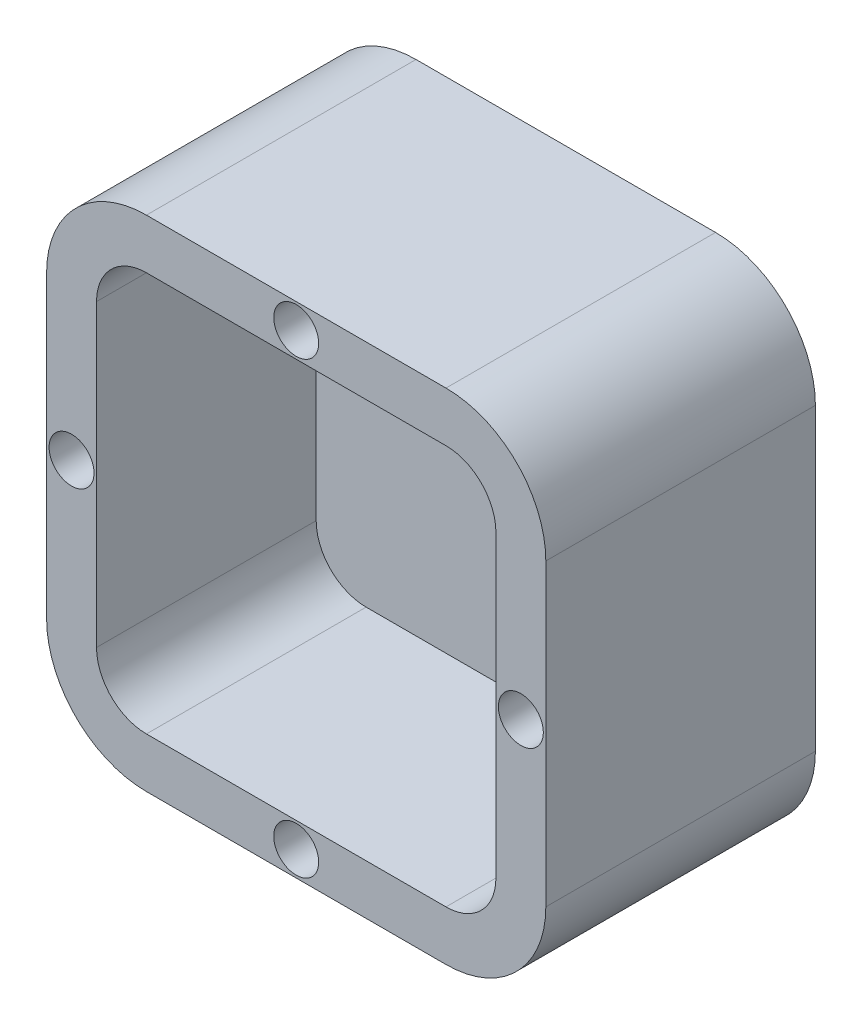
ISO-10303-21;
HEADER;
FILE_DESCRIPTION(('STEP AP214'),'2;1');
FILE_NAME('part.step','',(''),(''),'','','');
FILE_SCHEMA(('AUTOMOTIVE_DESIGN { 1 0 10303 214 1 1 1 1 }'));
ENDSEC;
DATA;
#1=APPLICATION_CONTEXT('core data for automotive mechanical design processes');
#2=APPLICATION_PROTOCOL_DEFINITION('international standard','automotive_design',2000,#1);
#3=PRODUCT_CONTEXT('',#1,'mechanical');
#4=PRODUCT('Part','Part','',(#3));
#5=PRODUCT_RELATED_PRODUCT_CATEGORY('part','',(#4));
#6=PRODUCT_DEFINITION_FORMATION('','',#4);
#7=PRODUCT_DEFINITION_CONTEXT('part definition',#1,'design');
#8=PRODUCT_DEFINITION('design','',#6,#7);
#9=PRODUCT_DEFINITION_SHAPE('','',#8);
#10=(LENGTH_UNIT() NAMED_UNIT(*) SI_UNIT(.MILLI.,.METRE.));
#11=(NAMED_UNIT(*) PLANE_ANGLE_UNIT() SI_UNIT($,.RADIAN.));
#12=(NAMED_UNIT(*) SI_UNIT($,.STERADIAN.) SOLID_ANGLE_UNIT());
#13=UNCERTAINTY_MEASURE_WITH_UNIT(LENGTH_MEASURE(1.E-05),#10,'distance_accuracy_value','');
#14=(GEOMETRIC_REPRESENTATION_CONTEXT(3) GLOBAL_UNCERTAINTY_ASSIGNED_CONTEXT((#13)) GLOBAL_UNIT_ASSIGNED_CONTEXT((#10,
#11,#12)) REPRESENTATION_CONTEXT('',''));
#15=CARTESIAN_POINT('',(0.,0.,0.));
#16=DIRECTION('',(0.,0.,1.));
#17=DIRECTION('',(1.,0.,0.));
#18=AXIS2_PLACEMENT_3D('',#15,#16,#17);
#19=CARTESIAN_POINT('',(0.,0.,27.));
#20=DIRECTION('',(1.,0.,0.));
#21=DIRECTION('',(0.,0.,-1.));
#22=AXIS2_PLACEMENT_3D('',#19,#20,#21);
#23=PLANE('',#22);
#24=DIRECTION('',(0.,-1.,0.));
#25=VECTOR('',#24,1.);
#26=CARTESIAN_POINT('',(0.,0.,0.));
#27=LINE('',#26,#25);
#28=CARTESIAN_POINT('',(0.,40.,0.));
#29=VERTEX_POINT('',#28);
#30=CARTESIAN_POINT('',(0.,10.,0.));
#31=VERTEX_POINT('',#30);
#32=EDGE_CURVE('E213',#29,#31,#27,.T.);
#33=ORIENTED_EDGE('',*,*,#32,.T.);
#34=DIRECTION('',(0.,0.,-1.));
#35=VECTOR('',#34,1.);
#36=CARTESIAN_POINT('',(0.,10.,27.));
#37=LINE('',#36,#35);
#38=CARTESIAN_POINT('',(0.,10.,27.));
#39=VERTEX_POINT('',#38);
#40=EDGE_CURVE('E264',#31,#39,#37,.F.);
#41=ORIENTED_EDGE('',*,*,#40,.T.);
#42=DIRECTION('',(0.,-1.,0.));
#43=VECTOR('',#42,1.);
#44=CARTESIAN_POINT('',(0.,0.,27.));
#45=LINE('',#44,#43);
#46=CARTESIAN_POINT('',(0.,40.,27.));
#47=VERTEX_POINT('',#46);
#48=EDGE_CURVE('E227',#47,#39,#45,.T.);
#49=ORIENTED_EDGE('',*,*,#48,.F.);
#50=DIRECTION('',(0.,0.,-1.));
#51=VECTOR('',#50,1.);
#52=CARTESIAN_POINT('',(0.,40.,27.));
#53=LINE('',#52,#51);
#54=EDGE_CURVE('E261',#47,#29,#53,.T.);
#55=ORIENTED_EDGE('',*,*,#54,.T.);
#56=EDGE_LOOP('',(#33,#41,#49,#55));
#57=FACE_BOUND('',#56,.T.);
#58=ADVANCED_FACE('F39',(#57),#23,.F.);
#59=CARTESIAN_POINT('',(0.,0.,27.));
#60=DIRECTION('',(0.,1.,0.));
#61=DIRECTION('',(0.,0.,1.));
#62=AXIS2_PLACEMENT_3D('',#59,#60,#61);
#63=PLANE('',#62);
#64=DIRECTION('',(1.,0.,0.));
#65=VECTOR('',#64,1.);
#66=CARTESIAN_POINT('',(0.,0.,27.));
#67=LINE('',#66,#65);
#68=CARTESIAN_POINT('',(10.,0.,27.));
#69=VERTEX_POINT('',#68);
#70=CARTESIAN_POINT('',(40.,0.,27.));
#71=VERTEX_POINT('',#70);
#72=EDGE_CURVE('E230',#69,#71,#67,.T.);
#73=ORIENTED_EDGE('',*,*,#72,.F.);
#74=DIRECTION('',(0.,0.,-1.));
#75=VECTOR('',#74,1.);
#76=CARTESIAN_POINT('',(10.,0.,27.));
#77=LINE('',#76,#75);
#78=CARTESIAN_POINT('',(10.,0.,0.));
#79=VERTEX_POINT('',#78);
#80=EDGE_CURVE('E250',#69,#79,#77,.T.);
#81=ORIENTED_EDGE('',*,*,#80,.T.);
#82=DIRECTION('',(1.,0.,0.));
#83=VECTOR('',#82,1.);
#84=CARTESIAN_POINT('',(0.,0.,0.));
#85=LINE('',#84,#83);
#86=CARTESIAN_POINT('',(40.,0.,0.));
#87=VERTEX_POINT('',#86);
#88=EDGE_CURVE('E242',#79,#87,#85,.T.);
#89=ORIENTED_EDGE('',*,*,#88,.T.);
#90=DIRECTION('',(0.,0.,-1.));
#91=VECTOR('',#90,1.);
#92=CARTESIAN_POINT('',(40.,0.,27.));
#93=LINE('',#92,#91);
#94=EDGE_CURVE('E239',#87,#71,#93,.F.);
#95=ORIENTED_EDGE('',*,*,#94,.T.);
#96=EDGE_LOOP('',(#73,#81,#89,#95));
#97=FACE_BOUND('',#96,.T.);
#98=ADVANCED_FACE('F310',(#97),#63,.F.);
#99=CARTESIAN_POINT('',(50.,0.,27.));
#100=DIRECTION('',(-1.,0.,0.));
#101=DIRECTION('',(0.,0.,1.));
#102=AXIS2_PLACEMENT_3D('',#99,#100,#101);
#103=PLANE('',#102);
#104=DIRECTION('',(0.,1.,0.));
#105=VECTOR('',#104,1.);
#106=CARTESIAN_POINT('',(50.,0.,27.));
#107=LINE('',#106,#105);
#108=CARTESIAN_POINT('',(50.,10.,27.));
#109=VERTEX_POINT('',#108);
#110=CARTESIAN_POINT('',(50.,40.,27.));
#111=VERTEX_POINT('',#110);
#112=EDGE_CURVE('E234',#109,#111,#107,.T.);
#113=ORIENTED_EDGE('',*,*,#112,.F.);
#114=DIRECTION('',(0.,0.,-1.));
#115=VECTOR('',#114,1.);
#116=CARTESIAN_POINT('',(50.,10.,27.));
#117=LINE('',#116,#115);
#118=CARTESIAN_POINT('',(50.,10.,0.));
#119=VERTEX_POINT('',#118);
#120=EDGE_CURVE('E276',#109,#119,#117,.T.);
#121=ORIENTED_EDGE('',*,*,#120,.T.);
#122=DIRECTION('',(0.,1.,0.));
#123=VECTOR('',#122,1.);
#124=CARTESIAN_POINT('',(50.,0.,0.));
#125=LINE('',#124,#123);
#126=CARTESIAN_POINT('',(50.,40.,0.));
#127=VERTEX_POINT('',#126);
#128=EDGE_CURVE('E245',#119,#127,#125,.T.);
#129=ORIENTED_EDGE('',*,*,#128,.T.);
#130=DIRECTION('',(0.,0.,-1.));
#131=VECTOR('',#130,1.);
#132=CARTESIAN_POINT('',(50.,40.,27.));
#133=LINE('',#132,#131);
#134=EDGE_CURVE('E274',#127,#111,#133,.F.);
#135=ORIENTED_EDGE('',*,*,#134,.T.);
#136=EDGE_LOOP('',(#113,#121,#129,#135));
#137=FACE_BOUND('',#136,.T.);
#138=ADVANCED_FACE('F282',(#137),#103,.F.);
#139=CARTESIAN_POINT('',(0.,50.,27.));
#140=DIRECTION('',(0.,-1.,0.));
#141=DIRECTION('',(0.,0.,-1.));
#142=AXIS2_PLACEMENT_3D('',#139,#140,#141);
#143=PLANE('',#142);
#144=DIRECTION('',(-1.,0.,0.));
#145=VECTOR('',#144,1.);
#146=CARTESIAN_POINT('',(0.,50.,27.));
#147=LINE('',#146,#145);
#148=CARTESIAN_POINT('',(40.,50.,27.));
#149=VERTEX_POINT('',#148);
#150=CARTESIAN_POINT('',(10.,50.,27.));
#151=VERTEX_POINT('',#150);
#152=EDGE_CURVE('E237',#149,#151,#147,.T.);
#153=ORIENTED_EDGE('',*,*,#152,.F.);
#154=DIRECTION('',(0.,0.,-1.));
#155=VECTOR('',#154,1.);
#156=CARTESIAN_POINT('',(40.,50.,27.));
#157=LINE('',#156,#155);
#158=CARTESIAN_POINT('',(40.,50.,0.));
#159=VERTEX_POINT('',#158);
#160=EDGE_CURVE('E11',#149,#159,#157,.T.);
#161=ORIENTED_EDGE('',*,*,#160,.T.);
#162=DIRECTION('',(-1.,0.,0.));
#163=VECTOR('',#162,1.);
#164=CARTESIAN_POINT('',(0.,50.,0.));
#165=LINE('',#164,#163);
#166=CARTESIAN_POINT('',(10.,50.,0.));
#167=VERTEX_POINT('',#166);
#168=EDGE_CURVE('E231',#159,#167,#165,.T.);
#169=ORIENTED_EDGE('',*,*,#168,.T.);
#170=DIRECTION('',(0.,0.,-1.));
#171=VECTOR('',#170,1.);
#172=CARTESIAN_POINT('',(10.,50.,27.));
#173=LINE('',#172,#171);
#174=EDGE_CURVE('E47',#167,#151,#173,.F.);
#175=ORIENTED_EDGE('',*,*,#174,.T.);
#176=EDGE_LOOP('',(#153,#161,#169,#175));
#177=FACE_BOUND('',#176,.T.);
#178=ADVANCED_FACE('F294',(#177),#143,.F.);
#179=CARTESIAN_POINT('',(0.,0.,27.));
#180=DIRECTION('',(0.,0.,-1.));
#181=DIRECTION('',(-1.,0.,0.));
#182=AXIS2_PLACEMENT_3D('',#179,#180,#181);
#183=PLANE('',#182);
#184=CARTESIAN_POINT('',(25.,2.50000000000001,27.));
#185=DIRECTION('',(0.,0.,1.));
#186=DIRECTION('',(1.,0.,0.));
#187=AXIS2_PLACEMENT_3D('',#184,#185,#186);
#188=CIRCLE('',#187,2.25);
#189=CARTESIAN_POINT('',(27.25,2.50000000000001,27.));
#190=VERTEX_POINT('',#189);
#191=EDGE_CURVE('E412',#190,#190,#188,.T.);
#192=ORIENTED_EDGE('',*,*,#191,.F.);
#193=EDGE_LOOP('',(#192));
#194=FACE_BOUND('',#193,.T.);
#195=CARTESIAN_POINT('',(2.50000000000001,25.0000000000001,27.));
#196=DIRECTION('',(0.,0.,1.));
#197=DIRECTION('',(1.,0.,0.));
#198=AXIS2_PLACEMENT_3D('',#195,#196,#197);
#199=CIRCLE('',#198,2.25);
#200=CARTESIAN_POINT('',(4.75000000000001,25.0000000000001,27.));
#201=VERTEX_POINT('',#200);
#202=EDGE_CURVE('E418',#201,#201,#199,.T.);
#203=ORIENTED_EDGE('',*,*,#202,.F.);
#204=EDGE_LOOP('',(#203));
#205=FACE_BOUND('',#204,.T.);
#206=CARTESIAN_POINT('',(25.0000000000002,47.5,27.));
#207=DIRECTION('',(0.,0.,1.));
#208=DIRECTION('',(1.,0.,0.));
#209=AXIS2_PLACEMENT_3D('',#206,#207,#208);
#210=CIRCLE('',#209,2.25);
#211=CARTESIAN_POINT('',(27.2500000000002,47.5,27.));
#212=VERTEX_POINT('',#211);
#213=EDGE_CURVE('E426',#212,#212,#210,.T.);
#214=ORIENTED_EDGE('',*,*,#213,.F.);
#215=EDGE_LOOP('',(#214));
#216=FACE_BOUND('',#215,.T.);
#217=CARTESIAN_POINT('',(47.5,24.9999999999998,27.));
#218=DIRECTION('',(0.,0.,1.));
#219=DIRECTION('',(1.,0.,0.));
#220=AXIS2_PLACEMENT_3D('',#217,#218,#219);
#221=CIRCLE('',#220,2.25);
#222=CARTESIAN_POINT('',(49.75,24.9999999999998,27.));
#223=VERTEX_POINT('',#222);
#224=EDGE_CURVE('E432',#223,#223,#221,.T.);
#225=ORIENTED_EDGE('',*,*,#224,.F.);
#226=EDGE_LOOP('',(#225));
#227=FACE_BOUND('',#226,.T.);
#228=DIRECTION('',(0.,-1.,0.));
#229=VECTOR('',#228,1.);
#230=CARTESIAN_POINT('',(5.,0.,27.));
#231=LINE('',#230,#229);
#232=CARTESIAN_POINT('',(5.,40.,27.));
#233=VERTEX_POINT('',#232);
#234=CARTESIAN_POINT('',(5.,10.,27.));
#235=VERTEX_POINT('',#234);
#236=EDGE_CURVE('E181',#233,#235,#231,.T.);
#237=ORIENTED_EDGE('',*,*,#236,.F.);
#238=CARTESIAN_POINT('',(10.,40.,27.));
#239=DIRECTION('',(0.,0.,-1.));
#240=DIRECTION('',(-1.,0.,0.));
#241=AXIS2_PLACEMENT_3D('',#238,#239,#240);
#242=CIRCLE('',#241,5.);
#243=CARTESIAN_POINT('',(10.,45.,27.));
#244=VERTEX_POINT('',#243);
#245=EDGE_CURVE('E183',#244,#233,#242,.F.);
#246=ORIENTED_EDGE('',*,*,#245,.F.);
#247=DIRECTION('',(-1.,0.,0.));
#248=VECTOR('',#247,1.);
#249=CARTESIAN_POINT('',(0.,45.,27.));
#250=LINE('',#249,#248);
#251=CARTESIAN_POINT('',(40.,45.,27.));
#252=VERTEX_POINT('',#251);
#253=EDGE_CURVE('E54',#252,#244,#250,.T.);
#254=ORIENTED_EDGE('',*,*,#253,.F.);
#255=CARTESIAN_POINT('',(40.,40.,27.));
#256=DIRECTION('',(0.,0.,-1.));
#257=DIRECTION('',(-1.,0.,0.));
#258=AXIS2_PLACEMENT_3D('',#255,#256,#257);
#259=CIRCLE('',#258,5.);
#260=CARTESIAN_POINT('',(45.,40.,27.));
#261=VERTEX_POINT('',#260);
#262=EDGE_CURVE('E185',#261,#252,#259,.F.);
#263=ORIENTED_EDGE('',*,*,#262,.F.);
#264=DIRECTION('',(0.,1.,0.));
#265=VECTOR('',#264,1.);
#266=CARTESIAN_POINT('',(45.,0.,27.));
#267=LINE('',#266,#265);
#268=CARTESIAN_POINT('',(45.,10.,27.));
#269=VERTEX_POINT('',#268);
#270=EDGE_CURVE('E221',#269,#261,#267,.T.);
#271=ORIENTED_EDGE('',*,*,#270,.F.);
#272=CARTESIAN_POINT('',(40.,10.,27.));
#273=DIRECTION('',(0.,0.,-1.));
#274=DIRECTION('',(-1.,0.,0.));
#275=AXIS2_PLACEMENT_3D('',#272,#273,#274);
#276=CIRCLE('',#275,5.);
#277=CARTESIAN_POINT('',(40.,5.,27.));
#278=VERTEX_POINT('',#277);
#279=EDGE_CURVE('E218',#278,#269,#276,.F.);
#280=ORIENTED_EDGE('',*,*,#279,.F.);
#281=DIRECTION('',(1.,0.,0.));
#282=VECTOR('',#281,1.);
#283=CARTESIAN_POINT('',(0.,5.,27.));
#284=LINE('',#283,#282);
#285=CARTESIAN_POINT('',(10.,5.,27.));
#286=VERTEX_POINT('',#285);
#287=EDGE_CURVE('E216',#286,#278,#284,.T.);
#288=ORIENTED_EDGE('',*,*,#287,.F.);
#289=CARTESIAN_POINT('',(10.,10.,27.));
#290=DIRECTION('',(0.,0.,-1.));
#291=DIRECTION('',(-1.,0.,0.));
#292=AXIS2_PLACEMENT_3D('',#289,#290,#291);
#293=CIRCLE('',#292,5.);
#294=EDGE_CURVE('E209',#235,#286,#293,.F.);
#295=ORIENTED_EDGE('',*,*,#294,.F.);
#296=EDGE_LOOP('',(#237,#246,#254,#263,#271,#280,#288,#295));
#297=FACE_BOUND('',#296,.T.);
#298=ORIENTED_EDGE('',*,*,#48,.T.);
#299=CARTESIAN_POINT('',(10.,10.,27.));
#300=DIRECTION('',(0.,0.,-1.));
#301=DIRECTION('',(-1.,0.,0.));
#302=AXIS2_PLACEMENT_3D('',#299,#300,#301);
#303=CIRCLE('',#302,10.);
#304=EDGE_CURVE('E272',#39,#69,#303,.F.);
#305=ORIENTED_EDGE('',*,*,#304,.T.);
#306=ORIENTED_EDGE('',*,*,#72,.T.);
#307=CARTESIAN_POINT('',(40.,10.,27.));
#308=DIRECTION('',(0.,0.,-1.));
#309=DIRECTION('',(-1.,0.,0.));
#310=AXIS2_PLACEMENT_3D('',#307,#308,#309);
#311=CIRCLE('',#310,10.);
#312=EDGE_CURVE('E270',#71,#109,#311,.F.);
#313=ORIENTED_EDGE('',*,*,#312,.T.);
#314=ORIENTED_EDGE('',*,*,#112,.T.);
#315=CARTESIAN_POINT('',(40.,40.,27.));
#316=DIRECTION('',(0.,0.,-1.));
#317=DIRECTION('',(-1.,0.,0.));
#318=AXIS2_PLACEMENT_3D('',#315,#316,#317);
#319=CIRCLE('',#318,10.);
#320=EDGE_CURVE('E268',#111,#149,#319,.F.);
#321=ORIENTED_EDGE('',*,*,#320,.T.);
#322=ORIENTED_EDGE('',*,*,#152,.T.);
#323=CARTESIAN_POINT('',(10.,40.,27.));
#324=DIRECTION('',(0.,0.,-1.));
#325=DIRECTION('',(-1.,0.,0.));
#326=AXIS2_PLACEMENT_3D('',#323,#324,#325);
#327=CIRCLE('',#326,10.);
#328=EDGE_CURVE('E266',#151,#47,#327,.F.);
#329=ORIENTED_EDGE('',*,*,#328,.T.);
#330=EDGE_LOOP('',(#298,#305,#306,#313,#314,#321,#322,#329));
#331=FACE_BOUND('',#330,.T.);
#332=ADVANCED_FACE('F297',(#194,#205,#216,#227,#297,#331),#183,.F.);
#333=CARTESIAN_POINT('',(0.,0.,0.));
#334=DIRECTION('',(0.,0.,-1.));
#335=DIRECTION('',(-1.,0.,0.));
#336=AXIS2_PLACEMENT_3D('',#333,#334,#335);
#337=PLANE('',#336);
#338=CARTESIAN_POINT('',(25.,32.,0.));
#339=DIRECTION('',(0.,0.,-1.));
#340=DIRECTION('',(-1.,0.,0.));
#341=AXIS2_PLACEMENT_3D('',#338,#339,#340);
#342=CIRCLE('',#341,1.55);
#343=CARTESIAN_POINT('',(23.45,32.,0.));
#344=VERTEX_POINT('',#343);
#345=EDGE_CURVE('E177',#344,#344,#342,.F.);
#346=ORIENTED_EDGE('',*,*,#345,.T.);
#347=EDGE_LOOP('',(#346));
#348=FACE_BOUND('',#347,.T.);
#349=CARTESIAN_POINT('',(25.,18.,0.));
#350=DIRECTION('',(0.,0.,-1.));
#351=DIRECTION('',(-1.,0.,0.));
#352=AXIS2_PLACEMENT_3D('',#349,#350,#351);
#353=CIRCLE('',#352,1.55);
#354=CARTESIAN_POINT('',(23.45,18.,0.));
#355=VERTEX_POINT('',#354);
#356=EDGE_CURVE('E411',#355,#355,#353,.F.);
#357=ORIENTED_EDGE('',*,*,#356,.T.);
#358=EDGE_LOOP('',(#357));
#359=FACE_BOUND('',#358,.T.);
#360=ORIENTED_EDGE('',*,*,#88,.F.);
#361=CARTESIAN_POINT('',(10.,10.,0.));
#362=DIRECTION('',(0.,0.,-1.));
#363=DIRECTION('',(-1.,0.,0.));
#364=AXIS2_PLACEMENT_3D('',#361,#362,#363);
#365=CIRCLE('',#364,10.);
#366=EDGE_CURVE('E259',#79,#31,#365,.T.);
#367=ORIENTED_EDGE('',*,*,#366,.T.);
#368=ORIENTED_EDGE('',*,*,#32,.F.);
#369=CARTESIAN_POINT('',(10.,40.,0.));
#370=DIRECTION('',(0.,0.,-1.));
#371=DIRECTION('',(-1.,0.,0.));
#372=AXIS2_PLACEMENT_3D('',#369,#370,#371);
#373=CIRCLE('',#372,10.);
#374=EDGE_CURVE('E253',#29,#167,#373,.T.);
#375=ORIENTED_EDGE('',*,*,#374,.T.);
#376=ORIENTED_EDGE('',*,*,#168,.F.);
#377=CARTESIAN_POINT('',(40.,40.,0.));
#378=DIRECTION('',(0.,0.,-1.));
#379=DIRECTION('',(-1.,0.,0.));
#380=AXIS2_PLACEMENT_3D('',#377,#378,#379);
#381=CIRCLE('',#380,10.);
#382=EDGE_CURVE('E255',#159,#127,#381,.T.);
#383=ORIENTED_EDGE('',*,*,#382,.T.);
#384=ORIENTED_EDGE('',*,*,#128,.F.);
#385=CARTESIAN_POINT('',(40.,10.,0.));
#386=DIRECTION('',(0.,0.,-1.));
#387=DIRECTION('',(-1.,0.,0.));
#388=AXIS2_PLACEMENT_3D('',#385,#386,#387);
#389=CIRCLE('',#388,10.);
#390=EDGE_CURVE('E257',#119,#87,#389,.T.);
#391=ORIENTED_EDGE('',*,*,#390,.T.);
#392=EDGE_LOOP('',(#360,#367,#368,#375,#376,#383,#384,#391));
#393=FACE_BOUND('',#392,.T.);
#394=ADVANCED_FACE('F288',(#348,#359,#393),#337,.T.);
#395=CARTESIAN_POINT('',(10.,10.,27.));
#396=DIRECTION('',(0.,0.,-1.));
#397=DIRECTION('',(-1.,0.,0.));
#398=AXIS2_PLACEMENT_3D('',#395,#396,#397);
#399=CYLINDRICAL_SURFACE('',#398,10.);
#400=ORIENTED_EDGE('',*,*,#304,.F.);
#401=ORIENTED_EDGE('',*,*,#40,.F.);
#402=ORIENTED_EDGE('',*,*,#366,.F.);
#403=ORIENTED_EDGE('',*,*,#80,.F.);
#404=EDGE_LOOP('',(#400,#401,#402,#403));
#405=FACE_BOUND('',#404,.T.);
#406=ADVANCED_FACE('F307',(#405),#399,.T.);
#407=CARTESIAN_POINT('',(40.,10.,27.));
#408=DIRECTION('',(0.,0.,-1.));
#409=DIRECTION('',(-1.,0.,0.));
#410=AXIS2_PLACEMENT_3D('',#407,#408,#409);
#411=CYLINDRICAL_SURFACE('',#410,10.);
#412=ORIENTED_EDGE('',*,*,#312,.F.);
#413=ORIENTED_EDGE('',*,*,#94,.F.);
#414=ORIENTED_EDGE('',*,*,#390,.F.);
#415=ORIENTED_EDGE('',*,*,#120,.F.);
#416=EDGE_LOOP('',(#412,#413,#414,#415));
#417=FACE_BOUND('',#416,.T.);
#418=ADVANCED_FACE('F312',(#417),#411,.T.);
#419=CARTESIAN_POINT('',(40.,40.,27.));
#420=DIRECTION('',(0.,0.,-1.));
#421=DIRECTION('',(-1.,0.,0.));
#422=AXIS2_PLACEMENT_3D('',#419,#420,#421);
#423=CYLINDRICAL_SURFACE('',#422,10.);
#424=ORIENTED_EDGE('',*,*,#320,.F.);
#425=ORIENTED_EDGE('',*,*,#134,.F.);
#426=ORIENTED_EDGE('',*,*,#382,.F.);
#427=ORIENTED_EDGE('',*,*,#160,.F.);
#428=EDGE_LOOP('',(#424,#425,#426,#427));
#429=FACE_BOUND('',#428,.T.);
#430=ADVANCED_FACE('F293',(#429),#423,.T.);
#431=CARTESIAN_POINT('',(10.,40.,27.));
#432=DIRECTION('',(0.,0.,-1.));
#433=DIRECTION('',(-1.,0.,0.));
#434=AXIS2_PLACEMENT_3D('',#431,#432,#433);
#435=CYLINDRICAL_SURFACE('',#434,10.);
#436=ORIENTED_EDGE('',*,*,#328,.F.);
#437=ORIENTED_EDGE('',*,*,#174,.F.);
#438=ORIENTED_EDGE('',*,*,#374,.F.);
#439=ORIENTED_EDGE('',*,*,#54,.F.);
#440=EDGE_LOOP('',(#436,#437,#438,#439));
#441=FACE_BOUND('',#440,.T.);
#442=ADVANCED_FACE('F41',(#441),#435,.T.);
#443=CARTESIAN_POINT('',(5.,0.,27.));
#444=DIRECTION('',(1.,0.,0.));
#445=DIRECTION('',(0.,0.,-1.));
#446=AXIS2_PLACEMENT_3D('',#443,#444,#445);
#447=PLANE('',#446);
#448=DIRECTION('',(0.,-1.,0.));
#449=VECTOR('',#448,1.);
#450=CARTESIAN_POINT('',(5.,0.,5.));
#451=LINE('',#450,#449);
#452=CARTESIAN_POINT('',(5.,40.,5.));
#453=VERTEX_POINT('',#452);
#454=CARTESIAN_POINT('',(5.,10.,5.));
#455=VERTEX_POINT('',#454);
#456=EDGE_CURVE('E169',#453,#455,#451,.T.);
#457=ORIENTED_EDGE('',*,*,#456,.F.);
#458=DIRECTION('',(0.,0.,-1.));
#459=VECTOR('',#458,1.);
#460=CARTESIAN_POINT('',(5.,40.,27.));
#461=LINE('',#460,#459);
#462=EDGE_CURVE('E165',#233,#453,#461,.T.);
#463=ORIENTED_EDGE('',*,*,#462,.F.);
#464=ORIENTED_EDGE('',*,*,#236,.T.);
#465=DIRECTION('',(0.,0.,-1.));
#466=VECTOR('',#465,1.);
#467=CARTESIAN_POINT('',(5.,10.,27.));
#468=LINE('',#467,#466);
#469=EDGE_CURVE('E158',#455,#235,#468,.F.);
#470=ORIENTED_EDGE('',*,*,#469,.F.);
#471=EDGE_LOOP('',(#457,#463,#464,#470));
#472=FACE_BOUND('',#471,.T.);
#473=ADVANCED_FACE('F179',(#472),#447,.T.);
#474=CARTESIAN_POINT('',(0.,5.,27.));
#475=DIRECTION('',(0.,1.,0.));
#476=DIRECTION('',(0.,0.,1.));
#477=AXIS2_PLACEMENT_3D('',#474,#475,#476);
#478=PLANE('',#477);
#479=ORIENTED_EDGE('',*,*,#287,.T.);
#480=DIRECTION('',(0.,0.,1.));
#481=VECTOR('',#480,1.);
#482=CARTESIAN_POINT('',(40.,5.,27.));
#483=LINE('',#482,#481);
#484=CARTESIAN_POINT('',(40.,5.,5.));
#485=VERTEX_POINT('',#484);
#486=EDGE_CURVE('E201',#485,#278,#483,.T.);
#487=ORIENTED_EDGE('',*,*,#486,.F.);
#488=DIRECTION('',(1.,0.,0.));
#489=VECTOR('',#488,1.);
#490=CARTESIAN_POINT('',(0.,5.,5.));
#491=LINE('',#490,#489);
#492=CARTESIAN_POINT('',(10.,5.,5.));
#493=VERTEX_POINT('',#492);
#494=EDGE_CURVE('E176',#493,#485,#491,.T.);
#495=ORIENTED_EDGE('',*,*,#494,.F.);
#496=DIRECTION('',(0.,0.,1.));
#497=VECTOR('',#496,1.);
#498=CARTESIAN_POINT('',(10.,5.,27.));
#499=LINE('',#498,#497);
#500=EDGE_CURVE('E161',#286,#493,#499,.F.);
#501=ORIENTED_EDGE('',*,*,#500,.F.);
#502=EDGE_LOOP('',(#479,#487,#495,#501));
#503=FACE_BOUND('',#502,.T.);
#504=ADVANCED_FACE('F361',(#503),#478,.T.);
#505=CARTESIAN_POINT('',(45.,0.,27.));
#506=DIRECTION('',(-1.,0.,0.));
#507=DIRECTION('',(0.,0.,1.));
#508=AXIS2_PLACEMENT_3D('',#505,#506,#507);
#509=PLANE('',#508);
#510=ORIENTED_EDGE('',*,*,#270,.T.);
#511=DIRECTION('',(0.,0.,1.));
#512=VECTOR('',#511,1.);
#513=CARTESIAN_POINT('',(45.,40.,27.));
#514=LINE('',#513,#512);
#515=CARTESIAN_POINT('',(45.,40.,5.));
#516=VERTEX_POINT('',#515);
#517=EDGE_CURVE('E207',#516,#261,#514,.T.);
#518=ORIENTED_EDGE('',*,*,#517,.F.);
#519=DIRECTION('',(0.,1.,0.));
#520=VECTOR('',#519,1.);
#521=CARTESIAN_POINT('',(45.,0.,5.));
#522=LINE('',#521,#520);
#523=CARTESIAN_POINT('',(45.,10.,5.));
#524=VERTEX_POINT('',#523);
#525=EDGE_CURVE('E190',#524,#516,#522,.T.);
#526=ORIENTED_EDGE('',*,*,#525,.F.);
#527=DIRECTION('',(0.,0.,1.));
#528=VECTOR('',#527,1.);
#529=CARTESIAN_POINT('',(45.,10.,27.));
#530=LINE('',#529,#528);
#531=EDGE_CURVE('E203',#269,#524,#530,.F.);
#532=ORIENTED_EDGE('',*,*,#531,.F.);
#533=EDGE_LOOP('',(#510,#518,#526,#532));
#534=FACE_BOUND('',#533,.T.);
#535=ADVANCED_FACE('F358',(#534),#509,.T.);
#536=CARTESIAN_POINT('',(0.,45.,27.));
#537=DIRECTION('',(0.,-1.,0.));
#538=DIRECTION('',(0.,0.,-1.));
#539=AXIS2_PLACEMENT_3D('',#536,#537,#538);
#540=PLANE('',#539);
#541=ORIENTED_EDGE('',*,*,#253,.T.);
#542=DIRECTION('',(0.,0.,-1.));
#543=VECTOR('',#542,1.);
#544=CARTESIAN_POINT('',(10.,45.,27.));
#545=LINE('',#544,#543);
#546=CARTESIAN_POINT('',(10.,45.,5.));
#547=VERTEX_POINT('',#546);
#548=EDGE_CURVE('E206',#547,#244,#545,.F.);
#549=ORIENTED_EDGE('',*,*,#548,.F.);
#550=DIRECTION('',(-1.,0.,0.));
#551=VECTOR('',#550,1.);
#552=CARTESIAN_POINT('',(0.,45.,5.));
#553=LINE('',#552,#551);
#554=CARTESIAN_POINT('',(40.,45.,5.));
#555=VERTEX_POINT('',#554);
#556=EDGE_CURVE('E194',#555,#547,#553,.T.);
#557=ORIENTED_EDGE('',*,*,#556,.F.);
#558=DIRECTION('',(0.,0.,-1.));
#559=VECTOR('',#558,1.);
#560=CARTESIAN_POINT('',(40.,45.,27.));
#561=LINE('',#560,#559);
#562=EDGE_CURVE('E210',#252,#555,#561,.T.);
#563=ORIENTED_EDGE('',*,*,#562,.F.);
#564=EDGE_LOOP('',(#541,#549,#557,#563));
#565=FACE_BOUND('',#564,.T.);
#566=ADVANCED_FACE('F354',(#565),#540,.T.);
#567=CARTESIAN_POINT('',(0.,0.,5.));
#568=DIRECTION('',(0.,0.,-1.));
#569=DIRECTION('',(-1.,0.,0.));
#570=AXIS2_PLACEMENT_3D('',#567,#568,#569);
#571=PLANE('',#570);
#572=CARTESIAN_POINT('',(25.,32.,5.));
#573=DIRECTION('',(0.,0.,1.));
#574=DIRECTION('',(1.,0.,0.));
#575=AXIS2_PLACEMENT_3D('',#572,#573,#574);
#576=CIRCLE('',#575,1.55);
#577=CARTESIAN_POINT('',(26.55,32.,5.));
#578=VERTEX_POINT('',#577);
#579=EDGE_CURVE('E438',#578,#578,#576,.T.);
#580=ORIENTED_EDGE('',*,*,#579,.F.);
#581=EDGE_LOOP('',(#580));
#582=FACE_BOUND('',#581,.T.);
#583=CARTESIAN_POINT('',(25.,18.,5.));
#584=DIRECTION('',(0.,0.,1.));
#585=DIRECTION('',(1.,0.,0.));
#586=AXIS2_PLACEMENT_3D('',#583,#584,#585);
#587=CIRCLE('',#586,1.55);
#588=CARTESIAN_POINT('',(26.55,18.,5.));
#589=VERTEX_POINT('',#588);
#590=EDGE_CURVE('E415',#589,#589,#587,.T.);
#591=ORIENTED_EDGE('',*,*,#590,.F.);
#592=EDGE_LOOP('',(#591));
#593=FACE_BOUND('',#592,.T.);
#594=ORIENTED_EDGE('',*,*,#494,.T.);
#595=CARTESIAN_POINT('',(40.,10.,5.));
#596=DIRECTION('',(0.,0.,-1.));
#597=DIRECTION('',(-1.,0.,0.));
#598=AXIS2_PLACEMENT_3D('',#595,#596,#597);
#599=CIRCLE('',#598,5.);
#600=EDGE_CURVE('E166',#524,#485,#599,.T.);
#601=ORIENTED_EDGE('',*,*,#600,.F.);
#602=ORIENTED_EDGE('',*,*,#525,.T.);
#603=CARTESIAN_POINT('',(40.,40.,5.));
#604=DIRECTION('',(0.,0.,-1.));
#605=DIRECTION('',(-1.,0.,0.));
#606=AXIS2_PLACEMENT_3D('',#603,#604,#605);
#607=CIRCLE('',#606,5.);
#608=EDGE_CURVE('E193',#555,#516,#607,.T.);
#609=ORIENTED_EDGE('',*,*,#608,.F.);
#610=ORIENTED_EDGE('',*,*,#556,.T.);
#611=CARTESIAN_POINT('',(10.,40.,5.));
#612=DIRECTION('',(0.,0.,-1.));
#613=DIRECTION('',(-1.,0.,0.));
#614=AXIS2_PLACEMENT_3D('',#611,#612,#613);
#615=CIRCLE('',#614,5.);
#616=EDGE_CURVE('E172',#453,#547,#615,.T.);
#617=ORIENTED_EDGE('',*,*,#616,.F.);
#618=ORIENTED_EDGE('',*,*,#456,.T.);
#619=CARTESIAN_POINT('',(10.,10.,5.));
#620=DIRECTION('',(0.,0.,-1.));
#621=DIRECTION('',(-1.,0.,0.));
#622=AXIS2_PLACEMENT_3D('',#619,#620,#621);
#623=CIRCLE('',#622,5.);
#624=EDGE_CURVE('E154',#493,#455,#623,.T.);
#625=ORIENTED_EDGE('',*,*,#624,.F.);
#626=EDGE_LOOP('',(#594,#601,#602,#609,#610,#617,#618,#625));
#627=FACE_BOUND('',#626,.T.);
#628=ADVANCED_FACE('F170',(#582,#593,#627),#571,.F.);
#629=CARTESIAN_POINT('',(10.,10.,27.));
#630=DIRECTION('',(0.,0.,-1.));
#631=DIRECTION('',(-1.,0.,0.));
#632=AXIS2_PLACEMENT_3D('',#629,#630,#631);
#633=CYLINDRICAL_SURFACE('',#632,5.);
#634=ORIENTED_EDGE('',*,*,#294,.T.);
#635=ORIENTED_EDGE('',*,*,#500,.T.);
#636=ORIENTED_EDGE('',*,*,#624,.T.);
#637=ORIENTED_EDGE('',*,*,#469,.T.);
#638=EDGE_LOOP('',(#634,#635,#636,#637));
#639=FACE_BOUND('',#638,.T.);
#640=ADVANCED_FACE('F156',(#639),#633,.F.);
#641=CARTESIAN_POINT('',(40.,10.,27.));
#642=DIRECTION('',(0.,0.,-1.));
#643=DIRECTION('',(-1.,0.,0.));
#644=AXIS2_PLACEMENT_3D('',#641,#642,#643);
#645=CYLINDRICAL_SURFACE('',#644,5.);
#646=ORIENTED_EDGE('',*,*,#279,.T.);
#647=ORIENTED_EDGE('',*,*,#531,.T.);
#648=ORIENTED_EDGE('',*,*,#600,.T.);
#649=ORIENTED_EDGE('',*,*,#486,.T.);
#650=EDGE_LOOP('',(#646,#647,#648,#649));
#651=FACE_BOUND('',#650,.T.);
#652=ADVANCED_FACE('F345',(#651),#645,.F.);
#653=CARTESIAN_POINT('',(40.,40.,27.));
#654=DIRECTION('',(0.,0.,-1.));
#655=DIRECTION('',(-1.,0.,0.));
#656=AXIS2_PLACEMENT_3D('',#653,#654,#655);
#657=CYLINDRICAL_SURFACE('',#656,5.);
#658=ORIENTED_EDGE('',*,*,#262,.T.);
#659=ORIENTED_EDGE('',*,*,#562,.T.);
#660=ORIENTED_EDGE('',*,*,#608,.T.);
#661=ORIENTED_EDGE('',*,*,#517,.T.);
#662=EDGE_LOOP('',(#658,#659,#660,#661));
#663=FACE_BOUND('',#662,.T.);
#664=ADVANCED_FACE('F341',(#663),#657,.F.);
#665=CARTESIAN_POINT('',(10.,40.,27.));
#666=DIRECTION('',(0.,0.,-1.));
#667=DIRECTION('',(-1.,0.,0.));
#668=AXIS2_PLACEMENT_3D('',#665,#666,#667);
#669=CYLINDRICAL_SURFACE('',#668,5.);
#670=ORIENTED_EDGE('',*,*,#245,.T.);
#671=ORIENTED_EDGE('',*,*,#462,.T.);
#672=ORIENTED_EDGE('',*,*,#616,.T.);
#673=ORIENTED_EDGE('',*,*,#548,.T.);
#674=EDGE_LOOP('',(#670,#671,#672,#673));
#675=FACE_BOUND('',#674,.T.);
#676=ADVANCED_FACE('F337',(#675),#669,.F.);
#677=CARTESIAN_POINT('',(25.,18.,-4.38406204335659));
#678=DIRECTION('',(0.,0.,1.));
#679=DIRECTION('',(1.,0.,0.));
#680=AXIS2_PLACEMENT_3D('',#677,#678,#679);
#681=CYLINDRICAL_SURFACE('',#680,1.55);
#682=ORIENTED_EDGE('',*,*,#590,.T.);
#683=EDGE_LOOP('',(#682));
#684=FACE_BOUND('',#683,.T.);
#685=ORIENTED_EDGE('',*,*,#356,.F.);
#686=EDGE_LOOP('',(#685));
#687=FACE_BOUND('',#686,.T.);
#688=ADVANCED_FACE('F340',(#684,#687),#681,.F.);
#689=CARTESIAN_POINT('',(25.,32.,-4.38406204335659));
#690=DIRECTION('',(0.,0.,1.));
#691=DIRECTION('',(1.,0.,0.));
#692=AXIS2_PLACEMENT_3D('',#689,#690,#691);
#693=CYLINDRICAL_SURFACE('',#692,1.55);
#694=ORIENTED_EDGE('',*,*,#579,.T.);
#695=EDGE_LOOP('',(#694));
#696=FACE_BOUND('',#695,.T.);
#697=ORIENTED_EDGE('',*,*,#345,.F.);
#698=EDGE_LOOP('',(#697));
#699=FACE_BOUND('',#698,.T.);
#700=ADVANCED_FACE('F370',(#696,#699),#693,.F.);
#701=CARTESIAN_POINT('',(47.5,24.9999999999998,22.));
#702=DIRECTION('',(0.,0.,1.));
#703=DIRECTION('',(1.,0.,0.));
#704=AXIS2_PLACEMENT_3D('',#701,#702,#703);
#705=CYLINDRICAL_SURFACE('',#704,2.25);
#706=CARTESIAN_POINT('',(47.5,24.9999999999998,22.));
#707=DIRECTION('',(0.,0.,1.));
#708=DIRECTION('',(1.,0.,0.));
#709=AXIS2_PLACEMENT_3D('',#706,#707,#708);
#710=CIRCLE('',#709,2.25);
#711=CARTESIAN_POINT('',(49.75,24.9999999999998,22.));
#712=VERTEX_POINT('',#711);
#713=EDGE_CURVE('E435',#712,#712,#710,.T.);
#714=ORIENTED_EDGE('',*,*,#713,.F.);
#715=EDGE_LOOP('',(#714));
#716=FACE_BOUND('',#715,.T.);
#717=ORIENTED_EDGE('',*,*,#224,.T.);
#718=EDGE_LOOP('',(#717));
#719=FACE_BOUND('',#718,.T.);
#720=ADVANCED_FACE('F374',(#716,#719),#705,.F.);
#721=CARTESIAN_POINT('',(47.5,24.9999999999998,22.));
#722=DIRECTION('',(0.,0.,1.));
#723=DIRECTION('',(1.,0.,0.));
#724=AXIS2_PLACEMENT_3D('',#721,#722,#723);
#725=PLANE('',#724);
#726=ORIENTED_EDGE('',*,*,#713,.T.);
#727=EDGE_LOOP('',(#726));
#728=FACE_BOUND('',#727,.T.);
#729=ADVANCED_FACE('F376',(#728),#725,.T.);
#730=CARTESIAN_POINT('',(25.0000000000002,47.5,22.));
#731=DIRECTION('',(0.,0.,1.));
#732=DIRECTION('',(1.,0.,0.));
#733=AXIS2_PLACEMENT_3D('',#730,#731,#732);
#734=CYLINDRICAL_SURFACE('',#733,2.25);
#735=CARTESIAN_POINT('',(25.0000000000002,47.5,22.));
#736=DIRECTION('',(0.,0.,1.));
#737=DIRECTION('',(1.,0.,0.));
#738=AXIS2_PLACEMENT_3D('',#735,#736,#737);
#739=CIRCLE('',#738,2.25);
#740=CARTESIAN_POINT('',(27.2500000000002,47.5,22.));
#741=VERTEX_POINT('',#740);
#742=EDGE_CURVE('E429',#741,#741,#739,.T.);
#743=ORIENTED_EDGE('',*,*,#742,.F.);
#744=EDGE_LOOP('',(#743));
#745=FACE_BOUND('',#744,.T.);
#746=ORIENTED_EDGE('',*,*,#213,.T.);
#747=EDGE_LOOP('',(#746));
#748=FACE_BOUND('',#747,.T.);
#749=ADVANCED_FACE('F379',(#745,#748),#734,.F.);
#750=CARTESIAN_POINT('',(25.0000000000002,47.5,22.));
#751=DIRECTION('',(0.,0.,1.));
#752=DIRECTION('',(1.,0.,0.));
#753=AXIS2_PLACEMENT_3D('',#750,#751,#752);
#754=PLANE('',#753);
#755=ORIENTED_EDGE('',*,*,#742,.T.);
#756=EDGE_LOOP('',(#755));
#757=FACE_BOUND('',#756,.T.);
#758=ADVANCED_FACE('F384',(#757),#754,.T.);
#759=CARTESIAN_POINT('',(2.50000000000001,25.0000000000001,22.));
#760=DIRECTION('',(0.,0.,1.));
#761=DIRECTION('',(1.,0.,0.));
#762=AXIS2_PLACEMENT_3D('',#759,#760,#761);
#763=CYLINDRICAL_SURFACE('',#762,2.25);
#764=CARTESIAN_POINT('',(2.50000000000001,25.0000000000001,22.));
#765=DIRECTION('',(0.,0.,1.));
#766=DIRECTION('',(1.,0.,0.));
#767=AXIS2_PLACEMENT_3D('',#764,#765,#766);
#768=CIRCLE('',#767,2.25);
#769=CARTESIAN_POINT('',(4.75000000000001,25.0000000000001,22.));
#770=VERTEX_POINT('',#769);
#771=EDGE_CURVE('E423',#770,#770,#768,.T.);
#772=ORIENTED_EDGE('',*,*,#771,.F.);
#773=EDGE_LOOP('',(#772));
#774=FACE_BOUND('',#773,.T.);
#775=ORIENTED_EDGE('',*,*,#202,.T.);
#776=EDGE_LOOP('',(#775));
#777=FACE_BOUND('',#776,.T.);
#778=ADVANCED_FACE('F387',(#774,#777),#763,.F.);
#779=CARTESIAN_POINT('',(2.50000000000001,25.0000000000001,22.));
#780=DIRECTION('',(0.,0.,1.));
#781=DIRECTION('',(1.,0.,0.));
#782=AXIS2_PLACEMENT_3D('',#779,#780,#781);
#783=PLANE('',#782);
#784=ORIENTED_EDGE('',*,*,#771,.T.);
#785=EDGE_LOOP('',(#784));
#786=FACE_BOUND('',#785,.T.);
#787=ADVANCED_FACE('F392',(#786),#783,.T.);
#788=CARTESIAN_POINT('',(25.,2.50000000000001,22.));
#789=DIRECTION('',(0.,0.,1.));
#790=DIRECTION('',(1.,0.,0.));
#791=AXIS2_PLACEMENT_3D('',#788,#789,#790);
#792=CYLINDRICAL_SURFACE('',#791,2.25);
#793=CARTESIAN_POINT('',(25.,2.50000000000001,22.));
#794=DIRECTION('',(0.,0.,1.));
#795=DIRECTION('',(1.,0.,0.));
#796=AXIS2_PLACEMENT_3D('',#793,#794,#795);
#797=CIRCLE('',#796,2.25);
#798=CARTESIAN_POINT('',(27.25,2.50000000000001,22.));
#799=VERTEX_POINT('',#798);
#800=EDGE_CURVE('E410',#799,#799,#797,.T.);
#801=ORIENTED_EDGE('',*,*,#800,.F.);
#802=EDGE_LOOP('',(#801));
#803=FACE_BOUND('',#802,.T.);
#804=ORIENTED_EDGE('',*,*,#191,.T.);
#805=EDGE_LOOP('',(#804));
#806=FACE_BOUND('',#805,.T.);
#807=ADVANCED_FACE('F395',(#803,#806),#792,.F.);
#808=CARTESIAN_POINT('',(25.,2.50000000000001,22.));
#809=DIRECTION('',(0.,0.,1.));
#810=DIRECTION('',(1.,0.,0.));
#811=AXIS2_PLACEMENT_3D('',#808,#809,#810);
#812=PLANE('',#811);
#813=ORIENTED_EDGE('',*,*,#800,.T.);
#814=EDGE_LOOP('',(#813));
#815=FACE_BOUND('',#814,.T.);
#816=ADVANCED_FACE('F402',(#815),#812,.T.);
#817=CLOSED_SHELL('',(#58,#98,#138,#178,#332,#394,#406,#418,#430,#442,#473,#504,#535,#566,#628,
#640,#652,#664,#676,#688,#700,#720,#729,#749,#758,#778,#787,#807,#816));
#818=MANIFOLD_SOLID_BREP('B2',#817);
#819=ADVANCED_BREP_SHAPE_REPRESENTATION('',(#18,#818),#14);
#820=SHAPE_DEFINITION_REPRESENTATION(#9,#819);
ENDSEC;
END-ISO-10303-21;
